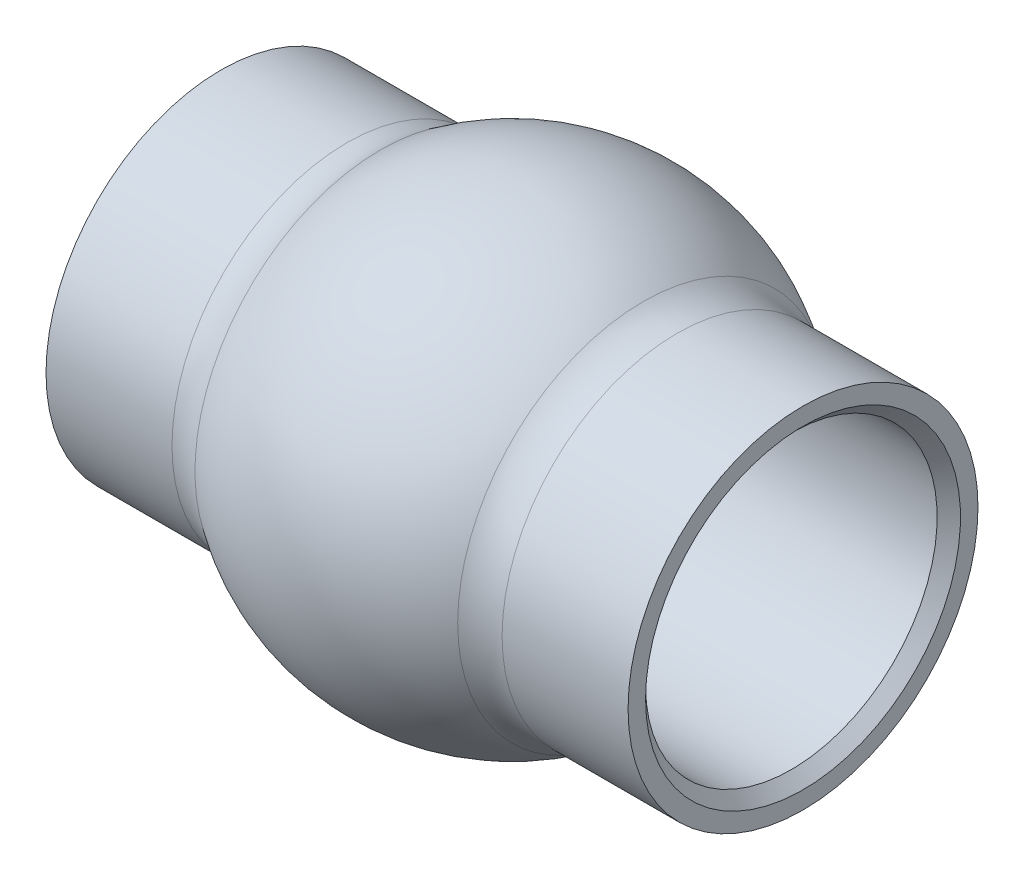
ISO-10303-21;
HEADER;
FILE_DESCRIPTION(('STEP AP214'),'2;1');
FILE_NAME('part.step','',(''),(''),'','','');
FILE_SCHEMA(('AUTOMOTIVE_DESIGN { 1 0 10303 214 1 1 1 1 }'));
ENDSEC;
DATA;
#1=APPLICATION_CONTEXT('core data for automotive mechanical design processes');
#2=APPLICATION_PROTOCOL_DEFINITION('international standard','automotive_design',2000,#1);
#3=PRODUCT_CONTEXT('',#1,'mechanical');
#4=PRODUCT('Part','Part','',(#3));
#5=PRODUCT_RELATED_PRODUCT_CATEGORY('part','',(#4));
#6=PRODUCT_DEFINITION_FORMATION('','',#4);
#7=PRODUCT_DEFINITION_CONTEXT('part definition',#1,'design');
#8=PRODUCT_DEFINITION('design','',#6,#7);
#9=PRODUCT_DEFINITION_SHAPE('','',#8);
#10=(LENGTH_UNIT() NAMED_UNIT(*) SI_UNIT(.MILLI.,.METRE.));
#11=(NAMED_UNIT(*) PLANE_ANGLE_UNIT() SI_UNIT($,.RADIAN.));
#12=(NAMED_UNIT(*) SI_UNIT($,.STERADIAN.) SOLID_ANGLE_UNIT());
#13=UNCERTAINTY_MEASURE_WITH_UNIT(LENGTH_MEASURE(1.E-05),#10,'distance_accuracy_value','');
#14=(GEOMETRIC_REPRESENTATION_CONTEXT(3) GLOBAL_UNCERTAINTY_ASSIGNED_CONTEXT((#13)) GLOBAL_UNIT_ASSIGNED_CONTEXT((#10,
#11,#12)) REPRESENTATION_CONTEXT('',''));
#15=CARTESIAN_POINT('',(0.,0.,0.));
#16=DIRECTION('',(0.,0.,1.));
#17=DIRECTION('',(1.,0.,0.));
#18=AXIS2_PLACEMENT_3D('',#15,#16,#17);
#19=CARTESIAN_POINT('',(-12.6746,7.62,0.));
#20=DIRECTION('',(1.,0.,0.));
#21=DIRECTION('',(0.,0.,-1.));
#22=AXIS2_PLACEMENT_3D('',#19,#20,#21);
#23=PLANE('',#22);
#24=CARTESIAN_POINT('',(-12.6746,0.,0.));
#25=DIRECTION('',(1.,0.,0.));
#26=DIRECTION('',(0.,0.,-1.));
#27=AXIS2_PLACEMENT_3D('',#24,#25,#26);
#28=CIRCLE('',#27,6.858);
#29=CARTESIAN_POINT('',(-12.6746,0.,-6.858));
#30=VERTEX_POINT('',#29);
#31=EDGE_CURVE('E49',#30,#30,#28,.T.);
#32=ORIENTED_EDGE('',*,*,#31,.T.);
#33=EDGE_LOOP('',(#32));
#34=FACE_BOUND('',#33,.T.);
#35=CARTESIAN_POINT('',(-12.6746,0.,0.));
#36=DIRECTION('',(-1.,0.,0.));
#37=DIRECTION('',(0.,0.,1.));
#38=AXIS2_PLACEMENT_3D('',#35,#36,#37);
#39=CIRCLE('',#38,7.62);
#40=CARTESIAN_POINT('',(-12.6746,0.,7.62));
#41=VERTEX_POINT('',#40);
#42=EDGE_CURVE('E86',#41,#41,#39,.T.);
#43=ORIENTED_EDGE('',*,*,#42,.T.);
#44=EDGE_LOOP('',(#43));
#45=FACE_BOUND('',#44,.T.);
#46=ADVANCED_FACE('F41',(#34,#45),#23,.F.);
#47=CARTESIAN_POINT('',(-29.7401848841665,0.,0.));
#48=DIRECTION('',(-1.,0.,0.));
#49=DIRECTION('',(0.,0.,1.));
#50=AXIS2_PLACEMENT_3D('',#47,#48,#49);
#51=CYLINDRICAL_SURFACE('',#50,6.35);
#52=CARTESIAN_POINT('',(-12.1666,0.,0.));
#53=DIRECTION('',(1.,0.,0.));
#54=DIRECTION('',(0.,0.,-1.));
#55=AXIS2_PLACEMENT_3D('',#52,#53,#54);
#56=CIRCLE('',#55,6.35);
#57=CARTESIAN_POINT('',(-12.1666,0.,-6.35));
#58=VERTEX_POINT('',#57);
#59=EDGE_CURVE('E56',#58,#58,#56,.F.);
#60=ORIENTED_EDGE('',*,*,#59,.T.);
#61=EDGE_LOOP('',(#60));
#62=FACE_BOUND('',#61,.T.);
#63=CARTESIAN_POINT('',(12.1666,0.,0.));
#64=DIRECTION('',(-1.,0.,0.));
#65=DIRECTION('',(0.,0.,1.));
#66=AXIS2_PLACEMENT_3D('',#63,#64,#65);
#67=CIRCLE('',#66,6.35);
#68=CARTESIAN_POINT('',(12.1666,0.,6.35));
#69=VERTEX_POINT('',#68);
#70=EDGE_CURVE('E62',#69,#69,#67,.F.);
#71=ORIENTED_EDGE('',*,*,#70,.T.);
#72=EDGE_LOOP('',(#71));
#73=FACE_BOUND('',#72,.T.);
#74=ADVANCED_FACE('F108',(#62,#73),#51,.F.);
#75=CARTESIAN_POINT('',(12.6746,6.35,0.));
#76=DIRECTION('',(-1.,0.,0.));
#77=DIRECTION('',(0.,0.,1.));
#78=AXIS2_PLACEMENT_3D('',#75,#76,#77);
#79=PLANE('',#78);
#80=CARTESIAN_POINT('',(12.6746,0.,0.));
#81=DIRECTION('',(-1.,0.,0.));
#82=DIRECTION('',(0.,0.,1.));
#83=AXIS2_PLACEMENT_3D('',#80,#81,#82);
#84=CIRCLE('',#83,6.858);
#85=CARTESIAN_POINT('',(12.6746,0.,6.858));
#86=VERTEX_POINT('',#85);
#87=EDGE_CURVE('E10',#86,#86,#84,.T.);
#88=ORIENTED_EDGE('',*,*,#87,.T.);
#89=EDGE_LOOP('',(#88));
#90=FACE_BOUND('',#89,.T.);
#91=CARTESIAN_POINT('',(12.6746,0.,0.));
#92=DIRECTION('',(-1.,0.,0.));
#93=DIRECTION('',(0.,0.,1.));
#94=AXIS2_PLACEMENT_3D('',#91,#92,#93);
#95=CIRCLE('',#94,7.62);
#96=CARTESIAN_POINT('',(12.6746,0.,7.62));
#97=VERTEX_POINT('',#96);
#98=EDGE_CURVE('E83',#97,#97,#95,.T.);
#99=ORIENTED_EDGE('',*,*,#98,.F.);
#100=EDGE_LOOP('',(#99));
#101=FACE_BOUND('',#100,.T.);
#102=ADVANCED_FACE('F113',(#90,#101),#79,.F.);
#103=CARTESIAN_POINT('',(-29.7401848841665,0.,0.));
#104=DIRECTION('',(-1.,0.,0.));
#105=DIRECTION('',(0.,0.,1.));
#106=AXIS2_PLACEMENT_3D('',#103,#104,#105);
#107=CYLINDRICAL_SURFACE('',#106,7.62);
#108=CARTESIAN_POINT('',(7.18869362262714,0.,0.));
#109=DIRECTION('',(-1.,0.,0.));
#110=DIRECTION('',(0.,0.,1.));
#111=AXIS2_PLACEMENT_3D('',#108,#109,#110);
#112=CIRCLE('',#111,7.62);
#113=CARTESIAN_POINT('',(7.18869362262714,0.,7.62));
#114=VERTEX_POINT('',#113);
#115=EDGE_CURVE('E67',#114,#114,#112,.F.);
#116=ORIENTED_EDGE('',*,*,#115,.T.);
#117=EDGE_LOOP('',(#116));
#118=FACE_BOUND('',#117,.T.);
#119=ORIENTED_EDGE('',*,*,#98,.T.);
#120=EDGE_LOOP('',(#119));
#121=FACE_BOUND('',#120,.T.);
#122=ADVANCED_FACE('F104',(#118,#121),#107,.T.);
#123=CARTESIAN_POINT('',(0.,0.,0.));
#124=DIRECTION('',(-1.,0.,0.));
#125=DIRECTION('',(0.,1.,0.));
#126=AXIS2_PLACEMENT_3D('',#123,#124,#125);
#127=SPHERICAL_SURFACE('',#126,9.906);
#128=CARTESIAN_POINT('',(-5.72161329147874,0.,0.));
#129=DIRECTION('',(1.,0.,0.));
#130=DIRECTION('',(0.,0.,-1.));
#131=AXIS2_PLACEMENT_3D('',#128,#129,#130);
#132=CIRCLE('',#131,8.08653061224489);
#133=CARTESIAN_POINT('',(-5.72161329147874,8.08653061224489,0.));
#134=VERTEX_POINT('',#133);
#135=EDGE_CURVE('E71',#134,#134,#132,.T.);
#136=CARTESIAN_POINT('',(5.72161329147874,0.,0.));
#137=DIRECTION('',(-1.,0.,0.));
#138=DIRECTION('',(0.,0.,1.));
#139=AXIS2_PLACEMENT_3D('',#136,#137,#138);
#140=CIRCLE('',#139,8.08653061224489);
#141=CARTESIAN_POINT('',(5.72161329147874,8.08653061224489,0.));
#142=VERTEX_POINT('',#141);
#143=EDGE_CURVE('E75',#142,#142,#140,.T.);
#144=CARTESIAN_POINT('',(-5.72161329147874,8.08653061224489,0.));
#145=CARTESIAN_POINT('',(-5.61787490299442,8.15993215443731,0.));
#146=CARTESIAN_POINT('',(-5.51272266986163,8.23133531677612,0.));
#147=CARTESIAN_POINT('',(-5.29974935996409,8.37004392123409,0.));
#148=CARTESIAN_POINT('',(-5.19192828319933,8.43734936335325,0.));
#149=CARTESIAN_POINT('',(-4.97377613170284,8.56776156685942,0.));
#150=CARTESIAN_POINT('',(-4.8634450569711,8.63086832824644,0.));
#151=CARTESIAN_POINT('',(-4.64043653153475,8.75279005402912,0.));
#152=CARTESIAN_POINT('',(-4.52775908083012,8.81160501842478,0.));
#153=CARTESIAN_POINT('',(-4.30022461660236,8.92485595432472,0.));
#154=CARTESIAN_POINT('',(-4.18536760307922,8.979291925829,0.));
#155=CARTESIAN_POINT('',(-3.95364413029699,9.08370428199777,0.));
#156=CARTESIAN_POINT('',(-3.83677767103789,9.13368066666226,0.));
#157=CARTESIAN_POINT('',(-3.60120837944226,9.22909982848233,0.));
#158=CARTESIAN_POINT('',(-3.48250554710573,9.27454260563791,0.));
#159=CARTESIAN_POINT('',(-3.24343930710602,9.36082725433811,0.));
#160=CARTESIAN_POINT('',(-3.12307589944283,9.40166912588274,0.));
#161=CARTESIAN_POINT('',(-2.88086676435769,9.47869147686519,0.));
#162=CARTESIAN_POINT('',(-2.75902103693574,9.514871956303,0.));
#163=CARTESIAN_POINT('',(-2.51402771357978,9.58251794060926,0.));
#164=CARTESIAN_POINT('',(-2.39088011764578,9.6139834454777,0.));
#165=CARTESIAN_POINT('',(-2.14346543644948,9.67215288080747,0.));
#166=CARTESIAN_POINT('',(-2.01919835118718,9.69885681126879,0.));
#167=CARTESIAN_POINT('',(-1.76972872848823,9.7474635497893,0.));
#168=CARTESIAN_POINT('',(-1.64452619105157,9.76936635784849,0.));
#169=CARTESIAN_POINT('',(-1.39337108653684,9.80833841392751,0.));
#170=CARTESIAN_POINT('',(-1.26741851945877,9.82540766194734,0.));
#171=CARTESIAN_POINT('',(-1.01494988897556,9.85468731872236,0.));
#172=CARTESIAN_POINT('',(-0.888433825570432,9.86689772747756,0.));
#173=CARTESIAN_POINT('',(-0.635025570274073,9.88644162234411,0.));
#174=CARTESIAN_POINT('',(-0.508133378382845,9.89377510845547,0.));
#175=CARTESIAN_POINT('',(-0.254160790994412,9.90355429728341,0.));
#176=CARTESIAN_POINT('',(-0.127080395497206,9.906,0.));
#177=CARTESIAN_POINT('',(0.127080395497206,9.906,0.));
#178=CARTESIAN_POINT('',(0.254160790994412,9.90355429728341,0.));
#179=CARTESIAN_POINT('',(0.508133378382845,9.89377510845547,0.));
#180=CARTESIAN_POINT('',(0.635025570274073,9.88644162234411,0.));
#181=CARTESIAN_POINT('',(0.888433825570432,9.86689772747756,0.));
#182=CARTESIAN_POINT('',(1.01494988897556,9.85468731872236,0.));
#183=CARTESIAN_POINT('',(1.26741851945877,9.82540766194734,0.));
#184=CARTESIAN_POINT('',(1.39337108653684,9.80833841392751,0.));
#185=CARTESIAN_POINT('',(1.64452619105157,9.76936635784849,0.));
#186=CARTESIAN_POINT('',(1.76972872848823,9.7474635497893,0.));
#187=CARTESIAN_POINT('',(2.01919835118718,9.69885681126879,0.));
#188=CARTESIAN_POINT('',(2.14346543644948,9.67215288080747,0.));
#189=CARTESIAN_POINT('',(2.39088011764578,9.6139834454777,0.));
#190=CARTESIAN_POINT('',(2.51402771357978,9.58251794060926,0.));
#191=CARTESIAN_POINT('',(2.75902103693574,9.514871956303,0.));
#192=CARTESIAN_POINT('',(2.88086676435769,9.47869147686519,0.));
#193=CARTESIAN_POINT('',(3.12307589944283,9.40166912588274,0.));
#194=CARTESIAN_POINT('',(3.24343930710602,9.36082725433811,0.));
#195=CARTESIAN_POINT('',(3.48250554710573,9.27454260563791,0.));
#196=CARTESIAN_POINT('',(3.60120837944226,9.22909982848233,0.));
#197=CARTESIAN_POINT('',(3.83677767103789,9.13368066666226,0.));
#198=CARTESIAN_POINT('',(3.95364413029699,9.08370428199777,0.));
#199=CARTESIAN_POINT('',(4.18536760307922,8.979291925829,0.));
#200=CARTESIAN_POINT('',(4.30022461660236,8.92485595432472,0.));
#201=CARTESIAN_POINT('',(4.52775908083012,8.81160501842478,0.));
#202=CARTESIAN_POINT('',(4.64043653153475,8.75279005402912,0.));
#203=CARTESIAN_POINT('',(4.8634450569711,8.63086832824644,0.));
#204=CARTESIAN_POINT('',(4.97377613170284,8.56776156685942,0.));
#205=CARTESIAN_POINT('',(5.19192828319933,8.43734936335325,0.));
#206=CARTESIAN_POINT('',(5.29974935996409,8.37004392123409,0.));
#207=CARTESIAN_POINT('',(5.51272266986163,8.23133531677612,0.));
#208=CARTESIAN_POINT('',(5.61787490299442,8.15993215443731,0.));
#209=CARTESIAN_POINT('',(5.72161329147874,8.08653061224489,0.));
#210=B_SPLINE_CURVE_WITH_KNOTS('',3,(#144,#145,#146,#147,#148,#149,#150,#151,#152,#153,#154,
#155,#156,#157,#158,#159,#160,#161,#162,#163,#164,#165,#166,#167,#168,#169,#170,#171,#172,#173,
#174,#175,#176,#177,#178,#179,#180,#181,#182,#183,#184,#185,#186,#187,#188,#189,#190,#191,#192,
#193,#194,#195,#196,#197,#198,#199,#200,#201,#202,#203,#204,#205,#206,#207,#208,#209),
.UNSPECIFIED.,.F.,.F.,(4,2,2,2,2,2,2,2,2,2,2,2,2,2,2,2,2,2,2,2,2,2,2,2,2,2,2,2,2,2,2,2,4),(0.,
0.38121766321963,0.762435326439257,1.14365298965889,1.52487065287852,1.90608831609814,
2.28730597931777,2.6685236425374,3.04974130575703,3.43095896897666,3.81217663219629,
4.19339429541592,4.57461195863554,4.95582962185517,5.3370472850748,5.71826494829443,
6.09948261151406,6.48070027473369,6.86191793795332,7.24313560117294,7.62435326439257,
8.0055709276122,8.38678859083183,8.76800625405146,9.14922391727108,9.53044158049071,
9.91165924371034,10.29287690693,10.6740945701496,11.0553122333692,11.4365298965889,
11.8177475598085,12.1989652230281),.UNSPECIFIED.);
#211=EDGE_CURVE('BSEAM94',#134,#142,#210,.T.);
#212=ORIENTED_EDGE('',*,*,#135,.T.);
#213=ORIENTED_EDGE('',*,*,#143,.T.);
#214=ORIENTED_EDGE('',*,*,#211,.T.);
#215=ORIENTED_EDGE('',*,*,#211,.F.);
#216=EDGE_LOOP('',(#212,#214,#213,#215));
#217=FACE_BOUND('',#216,.T.);
#218=ADVANCED_FACE('F94',(#217),#127,.T.);
#219=CARTESIAN_POINT('',(-29.7401848841665,0.,0.));
#220=DIRECTION('',(-1.,0.,0.));
#221=DIRECTION('',(0.,0.,1.));
#222=AXIS2_PLACEMENT_3D('',#219,#220,#221);
#223=CYLINDRICAL_SURFACE('',#222,7.62);
#224=CARTESIAN_POINT('',(-7.18869362262714,0.,0.));
#225=DIRECTION('',(1.,0.,0.));
#226=DIRECTION('',(0.,0.,-1.));
#227=AXIS2_PLACEMENT_3D('',#224,#225,#226);
#228=CIRCLE('',#227,7.62);
#229=CARTESIAN_POINT('',(-7.18869362262714,0.,-7.62));
#230=VERTEX_POINT('',#229);
#231=EDGE_CURVE('E79',#230,#230,#228,.F.);
#232=ORIENTED_EDGE('',*,*,#231,.T.);
#233=EDGE_LOOP('',(#232));
#234=FACE_BOUND('',#233,.T.);
#235=ORIENTED_EDGE('',*,*,#42,.F.);
#236=EDGE_LOOP('',(#235));
#237=FACE_BOUND('',#236,.T.);
#238=ADVANCED_FACE('F91',(#234,#237),#223,.T.);
#239=CARTESIAN_POINT('',(-7.18869362262714,0.,0.));
#240=DIRECTION('',(1.,0.,0.));
#241=DIRECTION('',(0.,0.,-1.));
#242=AXIS2_PLACEMENT_3D('',#239,#240,#241);
#243=TOROIDAL_SURFACE('',#242,10.16,2.54);
#244=ORIENTED_EDGE('',*,*,#135,.F.);
#245=EDGE_LOOP('',(#244));
#246=FACE_BOUND('',#245,.T.);
#247=ORIENTED_EDGE('',*,*,#231,.F.);
#248=EDGE_LOOP('',(#247));
#249=FACE_BOUND('',#248,.T.);
#250=ADVANCED_FACE('F93',(#246,#249),#243,.F.);
#251=CARTESIAN_POINT('',(7.18869362262714,0.,0.));
#252=DIRECTION('',(-1.,0.,0.));
#253=DIRECTION('',(0.,0.,1.));
#254=AXIS2_PLACEMENT_3D('',#251,#252,#253);
#255=TOROIDAL_SURFACE('',#254,10.16,2.54);
#256=ORIENTED_EDGE('',*,*,#115,.F.);
#257=EDGE_LOOP('',(#256));
#258=FACE_BOUND('',#257,.T.);
#259=ORIENTED_EDGE('',*,*,#143,.F.);
#260=EDGE_LOOP('',(#259));
#261=FACE_BOUND('',#260,.T.);
#262=ADVANCED_FACE('F101',(#258,#261),#255,.F.);
#263=CARTESIAN_POINT('',(-12.1666,0.,0.));
#264=DIRECTION('',(-1.,0.,0.));
#265=DIRECTION('',(0.,0.,1.));
#266=AXIS2_PLACEMENT_3D('',#263,#264,#265);
#267=CONICAL_SURFACE('',#266,6.35,0.785398163397454);
#268=ORIENTED_EDGE('',*,*,#31,.F.);
#269=EDGE_LOOP('',(#268));
#270=FACE_BOUND('',#269,.T.);
#271=ORIENTED_EDGE('',*,*,#59,.F.);
#272=EDGE_LOOP('',(#271));
#273=FACE_BOUND('',#272,.T.);
#274=ADVANCED_FACE('F119',(#270,#273),#267,.F.);
#275=CARTESIAN_POINT('',(12.6746,0.,0.));
#276=DIRECTION('',(1.,0.,0.));
#277=DIRECTION('',(0.,0.,-1.));
#278=AXIS2_PLACEMENT_3D('',#275,#276,#277);
#279=CONICAL_SURFACE('',#278,6.858,0.785398163397443);
#280=ORIENTED_EDGE('',*,*,#70,.F.);
#281=EDGE_LOOP('',(#280));
#282=FACE_BOUND('',#281,.T.);
#283=ORIENTED_EDGE('',*,*,#87,.F.);
#284=EDGE_LOOP('',(#283));
#285=FACE_BOUND('',#284,.T.);
#286=ADVANCED_FACE('F43',(#282,#285),#279,.F.);
#287=CLOSED_SHELL('',(#46,#74,#102,#122,#218,#238,#250,#262,#274,#286));
#288=MANIFOLD_SOLID_BREP('B2',#287);
#289=ADVANCED_BREP_SHAPE_REPRESENTATION('',(#18,#288),#14);
#290=SHAPE_DEFINITION_REPRESENTATION(#9,#289);
ENDSEC;
END-ISO-10303-21;
